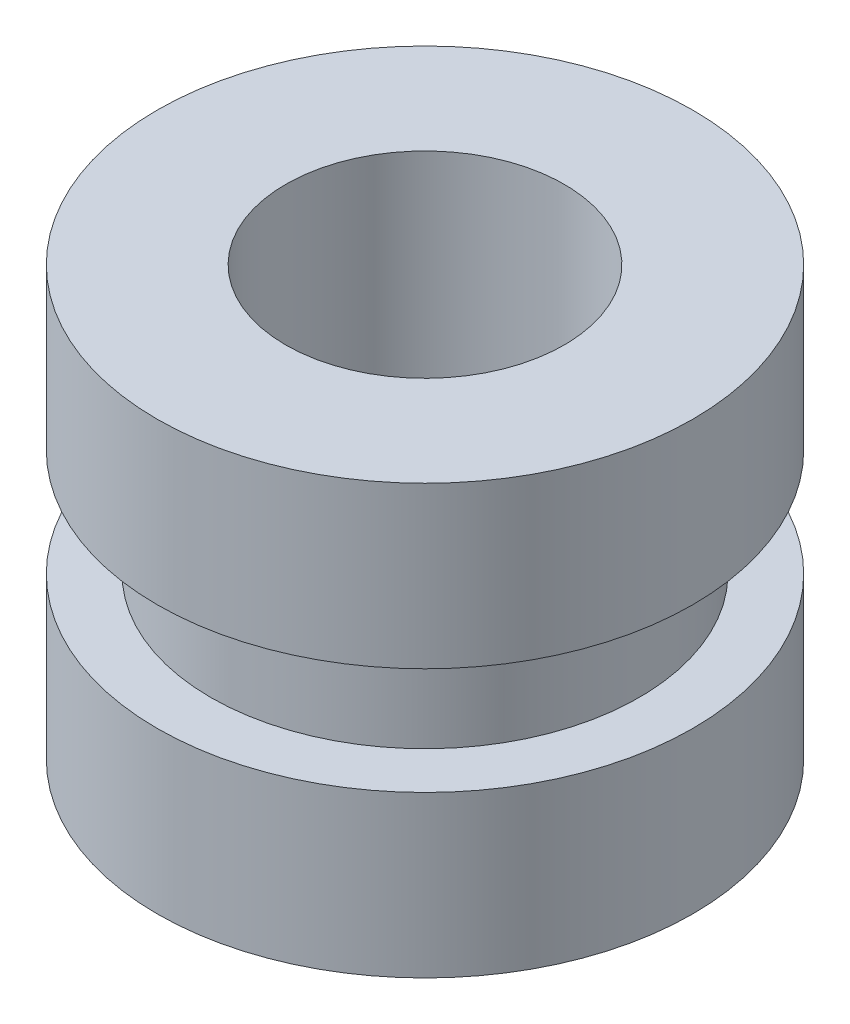
ISO-10303-21;
HEADER;
FILE_DESCRIPTION(('STEP AP214'),'2;1');
FILE_NAME('part.step','',(''),(''),'','','');
FILE_SCHEMA(('AUTOMOTIVE_DESIGN { 1 0 10303 214 1 1 1 1 }'));
ENDSEC;
DATA;
#1=APPLICATION_CONTEXT('core data for automotive mechanical design processes');
#2=APPLICATION_PROTOCOL_DEFINITION('international standard','automotive_design',2000,#1);
#3=PRODUCT_CONTEXT('',#1,'mechanical');
#4=PRODUCT('Part','Part','',(#3));
#5=PRODUCT_RELATED_PRODUCT_CATEGORY('part','',(#4));
#6=PRODUCT_DEFINITION_FORMATION('','',#4);
#7=PRODUCT_DEFINITION_CONTEXT('part definition',#1,'design');
#8=PRODUCT_DEFINITION('design','',#6,#7);
#9=PRODUCT_DEFINITION_SHAPE('','',#8);
#10=(LENGTH_UNIT() NAMED_UNIT(*) SI_UNIT(.MILLI.,.METRE.));
#11=(NAMED_UNIT(*) PLANE_ANGLE_UNIT() SI_UNIT($,.RADIAN.));
#12=(NAMED_UNIT(*) SI_UNIT($,.STERADIAN.) SOLID_ANGLE_UNIT());
#13=UNCERTAINTY_MEASURE_WITH_UNIT(LENGTH_MEASURE(1.E-05),#10,'distance_accuracy_value','');
#14=(GEOMETRIC_REPRESENTATION_CONTEXT(3) GLOBAL_UNCERTAINTY_ASSIGNED_CONTEXT((#13)) GLOBAL_UNIT_ASSIGNED_CONTEXT((#10,
#11,#12)) REPRESENTATION_CONTEXT('',''));
#15=CARTESIAN_POINT('',(0.,0.,0.));
#16=DIRECTION('',(0.,0.,1.));
#17=DIRECTION('',(1.,0.,0.));
#18=AXIS2_PLACEMENT_3D('',#15,#16,#17);
#19=CARTESIAN_POINT('',(0.,0.5,0.));
#20=DIRECTION('',(0.,-1.,0.));
#21=DIRECTION('',(0.,0.,-1.));
#22=AXIS2_PLACEMENT_3D('',#19,#20,#21);
#23=CYLINDRICAL_SURFACE('',#22,2.);
#24=CARTESIAN_POINT('',(0.,0.5,0.));
#25=DIRECTION('',(0.,1.,0.));
#26=DIRECTION('',(0.,0.,1.));
#27=AXIS2_PLACEMENT_3D('',#24,#25,#26);
#28=CIRCLE('',#27,2.);
#29=CARTESIAN_POINT('',(0.,0.5,2.));
#30=VERTEX_POINT('',#29);
#31=EDGE_CURVE('E10',#30,#30,#28,.T.);
#32=ORIENTED_EDGE('',*,*,#31,.F.);
#33=EDGE_LOOP('',(#32));
#34=FACE_BOUND('',#33,.T.);
#35=CARTESIAN_POINT('',(0.,-0.5,0.));
#36=DIRECTION('',(0.,1.,0.));
#37=DIRECTION('',(0.,0.,1.));
#38=AXIS2_PLACEMENT_3D('',#35,#36,#37);
#39=CIRCLE('',#38,2.);
#40=CARTESIAN_POINT('',(0.,-0.5,2.));
#41=VERTEX_POINT('',#40);
#42=EDGE_CURVE('E45',#41,#41,#39,.T.);
#43=ORIENTED_EDGE('',*,*,#42,.T.);
#44=EDGE_LOOP('',(#43));
#45=FACE_BOUND('',#44,.T.);
#46=ADVANCED_FACE('F39',(#34,#45),#23,.T.);
#47=CARTESIAN_POINT('',(0.,0.5,0.));
#48=DIRECTION('',(0.,-1.,0.));
#49=DIRECTION('',(0.,0.,-1.));
#50=AXIS2_PLACEMENT_3D('',#47,#48,#49);
#51=CYLINDRICAL_SURFACE('',#50,1.3);
#52=CARTESIAN_POINT('',(0.,2.,0.));
#53=DIRECTION('',(0.,1.,0.));
#54=DIRECTION('',(0.,0.,1.));
#55=AXIS2_PLACEMENT_3D('',#52,#53,#54);
#56=CIRCLE('',#55,1.3);
#57=CARTESIAN_POINT('',(0.,2.,1.3));
#58=VERTEX_POINT('',#57);
#59=EDGE_CURVE('E53',#58,#58,#56,.T.);
#60=ORIENTED_EDGE('',*,*,#59,.T.);
#61=EDGE_LOOP('',(#60));
#62=FACE_BOUND('',#61,.T.);
#63=CARTESIAN_POINT('',(0.,-2.,0.));
#64=DIRECTION('',(0.,1.,0.));
#65=DIRECTION('',(0.,0.,1.));
#66=AXIS2_PLACEMENT_3D('',#63,#64,#65);
#67=CIRCLE('',#66,1.3);
#68=CARTESIAN_POINT('',(0.,-2.,1.3));
#69=VERTEX_POINT('',#68);
#70=EDGE_CURVE('E65',#69,#69,#67,.T.);
#71=ORIENTED_EDGE('',*,*,#70,.F.);
#72=EDGE_LOOP('',(#71));
#73=FACE_BOUND('',#72,.T.);
#74=ADVANCED_FACE('F72',(#62,#73),#51,.F.);
#75=CARTESIAN_POINT('',(0.,2.,0.));
#76=DIRECTION('',(0.,1.,0.));
#77=DIRECTION('',(0.,0.,1.));
#78=AXIS2_PLACEMENT_3D('',#75,#76,#77);
#79=PLANE('',#78);
#80=CARTESIAN_POINT('',(0.,2.,0.));
#81=DIRECTION('',(0.,1.,0.));
#82=DIRECTION('',(0.,0.,1.));
#83=AXIS2_PLACEMENT_3D('',#80,#81,#82);
#84=CIRCLE('',#83,2.5);
#85=CARTESIAN_POINT('',(0.,2.,2.5));
#86=VERTEX_POINT('',#85);
#87=EDGE_CURVE('E46',#86,#86,#84,.T.);
#88=ORIENTED_EDGE('',*,*,#87,.T.);
#89=EDGE_LOOP('',(#88));
#90=FACE_BOUND('',#89,.T.);
#91=ORIENTED_EDGE('',*,*,#59,.F.);
#92=EDGE_LOOP('',(#91));
#93=FACE_BOUND('',#92,.T.);
#94=ADVANCED_FACE('F71',(#90,#93),#79,.T.);
#95=CARTESIAN_POINT('',(0.,0.5,0.));
#96=DIRECTION('',(0.,1.,0.));
#97=DIRECTION('',(0.,0.,1.));
#98=AXIS2_PLACEMENT_3D('',#95,#96,#97);
#99=PLANE('',#98);
#100=ORIENTED_EDGE('',*,*,#31,.T.);
#101=EDGE_LOOP('',(#100));
#102=FACE_BOUND('',#101,.T.);
#103=CARTESIAN_POINT('',(0.,0.5,0.));
#104=DIRECTION('',(0.,1.,0.));
#105=DIRECTION('',(0.,0.,1.));
#106=AXIS2_PLACEMENT_3D('',#103,#104,#105);
#107=CIRCLE('',#106,2.5);
#108=CARTESIAN_POINT('',(0.,0.5,2.5));
#109=VERTEX_POINT('',#108);
#110=EDGE_CURVE('E49',#109,#109,#107,.T.);
#111=ORIENTED_EDGE('',*,*,#110,.F.);
#112=EDGE_LOOP('',(#111));
#113=FACE_BOUND('',#112,.T.);
#114=ADVANCED_FACE('F78',(#102,#113),#99,.F.);
#115=CARTESIAN_POINT('',(0.,2.,0.));
#116=DIRECTION('',(0.,-1.,0.));
#117=DIRECTION('',(0.,0.,-1.));
#118=AXIS2_PLACEMENT_3D('',#115,#116,#117);
#119=CYLINDRICAL_SURFACE('',#118,2.5);
#120=ORIENTED_EDGE('',*,*,#87,.F.);
#121=EDGE_LOOP('',(#120));
#122=FACE_BOUND('',#121,.T.);
#123=ORIENTED_EDGE('',*,*,#110,.T.);
#124=EDGE_LOOP('',(#123));
#125=FACE_BOUND('',#124,.T.);
#126=ADVANCED_FACE('F88',(#122,#125),#119,.T.);
#127=CARTESIAN_POINT('',(0.,-2.,0.));
#128=DIRECTION('',(0.,1.,0.));
#129=DIRECTION('',(0.,0.,1.));
#130=AXIS2_PLACEMENT_3D('',#127,#128,#129);
#131=CYLINDRICAL_SURFACE('',#130,2.5);
#132=CARTESIAN_POINT('',(0.,-2.,0.));
#133=DIRECTION('',(0.,1.,0.));
#134=DIRECTION('',(0.,0.,1.));
#135=AXIS2_PLACEMENT_3D('',#132,#133,#134);
#136=CIRCLE('',#135,2.5);
#137=CARTESIAN_POINT('',(0.,-2.,2.5));
#138=VERTEX_POINT('',#137);
#139=EDGE_CURVE('E62',#138,#138,#136,.T.);
#140=ORIENTED_EDGE('',*,*,#139,.T.);
#141=EDGE_LOOP('',(#140));
#142=FACE_BOUND('',#141,.T.);
#143=CARTESIAN_POINT('',(0.,-0.5,0.));
#144=DIRECTION('',(0.,1.,0.));
#145=DIRECTION('',(0.,0.,1.));
#146=AXIS2_PLACEMENT_3D('',#143,#144,#145);
#147=CIRCLE('',#146,2.5);
#148=CARTESIAN_POINT('',(0.,-0.5,2.5));
#149=VERTEX_POINT('',#148);
#150=EDGE_CURVE('E59',#149,#149,#147,.T.);
#151=ORIENTED_EDGE('',*,*,#150,.F.);
#152=EDGE_LOOP('',(#151));
#153=FACE_BOUND('',#152,.T.);
#154=ADVANCED_FACE('F86',(#142,#153),#131,.T.);
#155=CARTESIAN_POINT('',(0.,-2.,0.));
#156=DIRECTION('',(0.,-1.,0.));
#157=DIRECTION('',(0.,0.,1.));
#158=AXIS2_PLACEMENT_3D('',#155,#156,#157);
#159=PLANE('',#158);
#160=ORIENTED_EDGE('',*,*,#70,.T.);
#161=EDGE_LOOP('',(#160));
#162=FACE_BOUND('',#161,.T.);
#163=ORIENTED_EDGE('',*,*,#139,.F.);
#164=EDGE_LOOP('',(#163));
#165=FACE_BOUND('',#164,.T.);
#166=ADVANCED_FACE('F68',(#162,#165),#159,.T.);
#167=CARTESIAN_POINT('',(0.,-0.5,0.));
#168=DIRECTION('',(0.,-1.,0.));
#169=DIRECTION('',(0.,0.,1.));
#170=AXIS2_PLACEMENT_3D('',#167,#168,#169);
#171=PLANE('',#170);
#172=ORIENTED_EDGE('',*,*,#42,.F.);
#173=EDGE_LOOP('',(#172));
#174=FACE_BOUND('',#173,.T.);
#175=ORIENTED_EDGE('',*,*,#150,.T.);
#176=EDGE_LOOP('',(#175));
#177=FACE_BOUND('',#176,.T.);
#178=ADVANCED_FACE('F94',(#174,#177),#171,.F.);
#179=CLOSED_SHELL('',(#46,#74,#94,#114,#126,#154,#166,#178));
#180=MANIFOLD_SOLID_BREP('B2',#179);
#181=ADVANCED_BREP_SHAPE_REPRESENTATION('',(#18,#180),#14);
#182=SHAPE_DEFINITION_REPRESENTATION(#9,#181);
ENDSEC;
END-ISO-10303-21;
